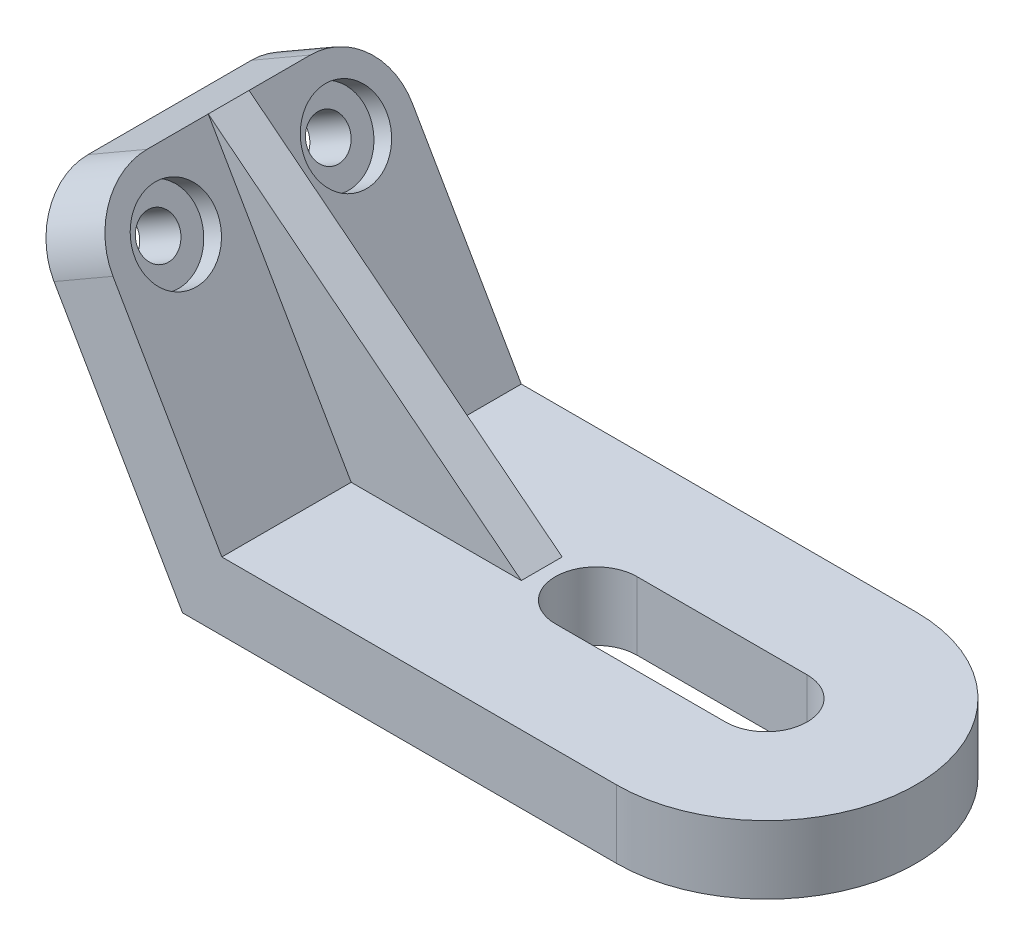
ISO-10303-21;
HEADER;
FILE_DESCRIPTION(('STEP AP214'),'2;1');
FILE_NAME('part.step','',(''),(''),'','','');
FILE_SCHEMA(('AUTOMOTIVE_DESIGN { 1 0 10303 214 1 1 1 1 }'));
ENDSEC;
DATA;
#1=APPLICATION_CONTEXT('core data for automotive mechanical design processes');
#2=APPLICATION_PROTOCOL_DEFINITION('international standard','automotive_design',2000,#1);
#3=PRODUCT_CONTEXT('',#1,'mechanical');
#4=PRODUCT('Part','Part','',(#3));
#5=PRODUCT_RELATED_PRODUCT_CATEGORY('part','',(#4));
#6=PRODUCT_DEFINITION_FORMATION('','',#4);
#7=PRODUCT_DEFINITION_CONTEXT('part definition',#1,'design');
#8=PRODUCT_DEFINITION('design','',#6,#7);
#9=PRODUCT_DEFINITION_SHAPE('','',#8);
#10=(LENGTH_UNIT() NAMED_UNIT(*) SI_UNIT(.MILLI.,.METRE.));
#11=(NAMED_UNIT(*) PLANE_ANGLE_UNIT() SI_UNIT($,.RADIAN.));
#12=(NAMED_UNIT(*) SI_UNIT($,.STERADIAN.) SOLID_ANGLE_UNIT());
#13=UNCERTAINTY_MEASURE_WITH_UNIT(LENGTH_MEASURE(1.E-05),#10,'distance_accuracy_value','');
#14=(GEOMETRIC_REPRESENTATION_CONTEXT(3) GLOBAL_UNCERTAINTY_ASSIGNED_CONTEXT((#13)) GLOBAL_UNIT_ASSIGNED_CONTEXT((#10,
#11,#12)) REPRESENTATION_CONTEXT('',''));
#15=CARTESIAN_POINT('',(0.,0.,0.));
#16=DIRECTION('',(0.,0.,1.));
#17=DIRECTION('',(1.,0.,0.));
#18=AXIS2_PLACEMENT_3D('',#15,#16,#17);
#19=CARTESIAN_POINT('',(-58.,9.99999999999999,-22.));
#20=DIRECTION('',(0.86602540378444,0.499999999999999,0.));
#21=DIRECTION('',(-0.499999999999999,0.86602540378444,0.));
#22=AXIS2_PLACEMENT_3D('',#19,#20,#21);
#23=PLANE('',#22);
#24=CARTESIAN_POINT('',(-74.2633297940228,38.1689135034962,-12.5));
#25=DIRECTION('',(0.866025403784439,0.499999999999999,0.));
#26=DIRECTION('',(-0.499999999999999,0.866025403784439,0.));
#27=AXIS2_PLACEMENT_3D('',#24,#25,#26);
#28=CIRCLE('',#27,6.);
#29=CARTESIAN_POINT('',(-77.2633297940228,43.3650659262029,-12.5));
#30=VERTEX_POINT('',#29);
#31=EDGE_CURVE('E395',#30,#30,#28,.T.);
#32=ORIENTED_EDGE('',*,*,#31,.F.);
#33=EDGE_LOOP('',(#32));
#34=FACE_BOUND('',#33,.T.);
#35=DIRECTION('',(-0.499999999999999,0.866025403784439,0.));
#36=VECTOR('',#35,1.);
#37=CARTESIAN_POINT('',(-58.,9.99999999999999,-22.));
#38=LINE('',#37,#36);
#39=CARTESIAN_POINT('',(-58.,9.99999999999999,-22.));
#40=VERTEX_POINT('',#39);
#41=CARTESIAN_POINT('',(-74.,37.7128129211021,-22.));
#42=VERTEX_POINT('',#41);
#43=EDGE_CURVE('E279',#40,#42,#38,.T.);
#44=ORIENTED_EDGE('',*,*,#43,.T.);
#45=CARTESIAN_POINT('',(-74.,37.7128129211021,-12.));
#46=DIRECTION('',(0.86602540378444,0.499999999999999,0.));
#47=DIRECTION('',(-0.499999999999999,0.86602540378444,0.));
#48=AXIS2_PLACEMENT_3D('',#45,#46,#47);
#49=CIRCLE('',#48,10.);
#50=CARTESIAN_POINT('',(-78.9999999999999,46.3730669589465,-12.));
#51=VERTEX_POINT('',#50);
#52=EDGE_CURVE('E162',#42,#51,#49,.T.);
#53=ORIENTED_EDGE('',*,*,#52,.T.);
#54=DIRECTION('',(0.,0.,1.));
#55=VECTOR('',#54,1.);
#56=CARTESIAN_POINT('',(-78.9999999999999,46.3730669589465,-22.));
#57=LINE('',#56,#55);
#58=CARTESIAN_POINT('',(-78.9999999999999,46.3730669589465,-3.));
#59=VERTEX_POINT('',#58);
#60=EDGE_CURVE('E157',#51,#59,#57,.T.);
#61=ORIENTED_EDGE('',*,*,#60,.T.);
#62=DIRECTION('',(0.499999999999999,-0.86602540378444,0.));
#63=VECTOR('',#62,1.);
#64=CARTESIAN_POINT('',(-58.,9.99999999999999,-3.));
#65=LINE('',#64,#63);
#66=CARTESIAN_POINT('',(-58.,9.99999999999999,-3.));
#67=VERTEX_POINT('',#66);
#68=EDGE_CURVE('E159',#59,#67,#65,.T.);
#69=ORIENTED_EDGE('',*,*,#68,.T.);
#70=DIRECTION('',(0.,0.,1.));
#71=VECTOR('',#70,1.);
#72=CARTESIAN_POINT('',(-58.,9.99999999999999,-22.));
#73=LINE('',#72,#71);
#74=EDGE_CURVE('E298',#40,#67,#73,.T.);
#75=ORIENTED_EDGE('',*,*,#74,.F.);
#76=EDGE_LOOP('',(#44,#53,#61,#69,#75));
#77=FACE_BOUND('',#76,.T.);
#78=ADVANCED_FACE('F47',(#34,#77),#23,.T.);
#79=CARTESIAN_POINT('',(0.,0.,-22.));
#80=DIRECTION('',(0.,-1.,0.));
#81=DIRECTION('',(1.,0.,0.));
#82=AXIS2_PLACEMENT_3D('',#79,#80,#81);
#83=PLANE('',#82);
#84=DIRECTION('',(1.,0.,0.));
#85=VECTOR('',#84,1.);
#86=CARTESIAN_POINT('',(0.,0.,22.));
#87=LINE('',#86,#85);
#88=CARTESIAN_POINT('',(-63.7735026918963,0.,22.));
#89=VERTEX_POINT('',#88);
#90=CARTESIAN_POINT('',(0.,0.,22.));
#91=VERTEX_POINT('',#90);
#92=EDGE_CURVE('E267',#89,#91,#87,.T.);
#93=ORIENTED_EDGE('',*,*,#92,.F.);
#94=DIRECTION('',(0.,0.,1.));
#95=VECTOR('',#94,1.);
#96=CARTESIAN_POINT('',(-63.7735026918963,0.,-22.));
#97=LINE('',#96,#95);
#98=CARTESIAN_POINT('',(-63.7735026918963,0.,-22.));
#99=VERTEX_POINT('',#98);
#100=EDGE_CURVE('E290',#99,#89,#97,.T.);
#101=ORIENTED_EDGE('',*,*,#100,.F.);
#102=DIRECTION('',(1.,0.,0.));
#103=VECTOR('',#102,1.);
#104=CARTESIAN_POINT('',(0.,0.,-22.));
#105=LINE('',#104,#103);
#106=CARTESIAN_POINT('',(0.,0.,-22.));
#107=VERTEX_POINT('',#106);
#108=EDGE_CURVE('E285',#99,#107,#105,.T.);
#109=ORIENTED_EDGE('',*,*,#108,.T.);
#110=CARTESIAN_POINT('',(0.,0.,0.));
#111=DIRECTION('',(0.,1.,0.));
#112=DIRECTION('',(-1.,0.,0.));
#113=AXIS2_PLACEMENT_3D('',#110,#111,#112);
#114=CIRCLE('',#113,22.);
#115=EDGE_CURVE('E235',#91,#107,#114,.T.);
#116=ORIENTED_EDGE('',*,*,#115,.F.);
#117=EDGE_LOOP('',(#93,#101,#109,#116));
#118=FACE_BOUND('',#117,.T.);
#119=CARTESIAN_POINT('',(-25.,0.,0.));
#120=DIRECTION('',(0.,1.,0.));
#121=DIRECTION('',(-1.,0.,0.));
#122=AXIS2_PLACEMENT_3D('',#119,#120,#121);
#123=CIRCLE('',#122,6.);
#124=CARTESIAN_POINT('',(-25.,0.,-6.));
#125=VERTEX_POINT('',#124);
#126=CARTESIAN_POINT('',(-25.,0.,6.));
#127=VERTEX_POINT('',#126);
#128=EDGE_CURVE('E207',#125,#127,#123,.T.);
#129=ORIENTED_EDGE('',*,*,#128,.T.);
#130=DIRECTION('',(1.,0.,0.));
#131=VECTOR('',#130,1.);
#132=CARTESIAN_POINT('',(0.,0.,6.));
#133=LINE('',#132,#131);
#134=CARTESIAN_POINT('',(0.,0.,6.));
#135=VERTEX_POINT('',#134);
#136=EDGE_CURVE('E211',#127,#135,#133,.T.);
#137=ORIENTED_EDGE('',*,*,#136,.T.);
#138=CARTESIAN_POINT('',(0.,0.,0.));
#139=DIRECTION('',(0.,1.,0.));
#140=DIRECTION('',(-1.,0.,0.));
#141=AXIS2_PLACEMENT_3D('',#138,#139,#140);
#142=CIRCLE('',#141,6.);
#143=CARTESIAN_POINT('',(0.,0.,-6.));
#144=VERTEX_POINT('',#143);
#145=EDGE_CURVE('E231',#135,#144,#142,.T.);
#146=ORIENTED_EDGE('',*,*,#145,.T.);
#147=DIRECTION('',(1.,0.,0.));
#148=VECTOR('',#147,1.);
#149=CARTESIAN_POINT('',(0.,0.,-6.));
#150=LINE('',#149,#148);
#151=EDGE_CURVE('E204',#125,#144,#150,.T.);
#152=ORIENTED_EDGE('',*,*,#151,.F.);
#153=EDGE_LOOP('',(#129,#137,#146,#152));
#154=FACE_BOUND('',#153,.T.);
#155=ADVANCED_FACE('F330',(#118,#154),#83,.T.);
#156=CARTESIAN_POINT('',(0.,10.,-22.));
#157=DIRECTION('',(0.,1.,0.));
#158=DIRECTION('',(-1.,0.,0.));
#159=AXIS2_PLACEMENT_3D('',#156,#157,#158);
#160=PLANE('',#159);
#161=DIRECTION('',(1.,0.,0.));
#162=VECTOR('',#161,1.);
#163=CARTESIAN_POINT('',(0.,10.,3.));
#164=LINE('',#163,#162);
#165=CARTESIAN_POINT('',(-58.,9.99999999999999,3.));
#166=VERTEX_POINT('',#165);
#167=CARTESIAN_POINT('',(-33.,10.,3.));
#168=VERTEX_POINT('',#167);
#169=EDGE_CURVE('E194',#166,#168,#164,.T.);
#170=ORIENTED_EDGE('',*,*,#169,.F.);
#171=CARTESIAN_POINT('',(-58.,9.99999999999999,22.));
#172=VERTEX_POINT('',#171);
#173=EDGE_CURVE('E289',#166,#172,#73,.T.);
#174=ORIENTED_EDGE('',*,*,#173,.T.);
#175=DIRECTION('',(-1.,0.,0.));
#176=VECTOR('',#175,1.);
#177=CARTESIAN_POINT('',(0.,10.,22.));
#178=LINE('',#177,#176);
#179=CARTESIAN_POINT('',(0.,10.,22.));
#180=VERTEX_POINT('',#179);
#181=EDGE_CURVE('E257',#180,#172,#178,.T.);
#182=ORIENTED_EDGE('',*,*,#181,.F.);
#183=CARTESIAN_POINT('',(0.,10.,0.));
#184=DIRECTION('',(0.,1.,0.));
#185=DIRECTION('',(-1.,0.,0.));
#186=AXIS2_PLACEMENT_3D('',#183,#184,#185);
#187=CIRCLE('',#186,22.);
#188=CARTESIAN_POINT('',(0.,10.,-22.));
#189=VERTEX_POINT('',#188);
#190=EDGE_CURVE('E236',#180,#189,#187,.T.);
#191=ORIENTED_EDGE('',*,*,#190,.T.);
#192=DIRECTION('',(-1.,0.,0.));
#193=VECTOR('',#192,1.);
#194=CARTESIAN_POINT('',(0.,10.,-22.));
#195=LINE('',#194,#193);
#196=EDGE_CURVE('E275',#189,#40,#195,.T.);
#197=ORIENTED_EDGE('',*,*,#196,.T.);
#198=ORIENTED_EDGE('',*,*,#74,.T.);
#199=DIRECTION('',(1.,0.,0.));
#200=VECTOR('',#199,1.);
#201=CARTESIAN_POINT('',(0.,10.,-3.));
#202=LINE('',#201,#200);
#203=CARTESIAN_POINT('',(-33.,10.,-3.));
#204=VERTEX_POINT('',#203);
#205=EDGE_CURVE('E177',#67,#204,#202,.T.);
#206=ORIENTED_EDGE('',*,*,#205,.T.);
#207=DIRECTION('',(0.,0.,1.));
#208=VECTOR('',#207,1.);
#209=CARTESIAN_POINT('',(-33.,10.,-22.));
#210=LINE('',#209,#208);
#211=EDGE_CURVE('E187',#168,#204,#210,.F.);
#212=ORIENTED_EDGE('',*,*,#211,.F.);
#213=EDGE_LOOP('',(#170,#174,#182,#191,#197,#198,#206,#212));
#214=FACE_BOUND('',#213,.T.);
#215=CARTESIAN_POINT('',(-25.,10.,0.));
#216=DIRECTION('',(0.,1.,0.));
#217=DIRECTION('',(-1.,0.,0.));
#218=AXIS2_PLACEMENT_3D('',#215,#216,#217);
#219=CIRCLE('',#218,6.);
#220=CARTESIAN_POINT('',(-25.,10.,-6.));
#221=VERTEX_POINT('',#220);
#222=CARTESIAN_POINT('',(-25.,10.,6.));
#223=VERTEX_POINT('',#222);
#224=EDGE_CURVE('E219',#221,#223,#219,.T.);
#225=ORIENTED_EDGE('',*,*,#224,.F.);
#226=DIRECTION('',(1.,0.,0.));
#227=VECTOR('',#226,1.);
#228=CARTESIAN_POINT('',(0.,10.,-6.));
#229=LINE('',#228,#227);
#230=CARTESIAN_POINT('',(0.,10.,-6.));
#231=VERTEX_POINT('',#230);
#232=EDGE_CURVE('E198',#221,#231,#229,.T.);
#233=ORIENTED_EDGE('',*,*,#232,.T.);
#234=CARTESIAN_POINT('',(0.,10.,0.));
#235=DIRECTION('',(0.,1.,0.));
#236=DIRECTION('',(-1.,0.,0.));
#237=AXIS2_PLACEMENT_3D('',#234,#235,#236);
#238=CIRCLE('',#237,6.);
#239=CARTESIAN_POINT('',(0.,10.,6.));
#240=VERTEX_POINT('',#239);
#241=EDGE_CURVE('E228',#240,#231,#238,.T.);
#242=ORIENTED_EDGE('',*,*,#241,.F.);
#243=DIRECTION('',(1.,0.,0.));
#244=VECTOR('',#243,1.);
#245=CARTESIAN_POINT('',(0.,10.,6.));
#246=LINE('',#245,#244);
#247=EDGE_CURVE('E208',#223,#240,#246,.T.);
#248=ORIENTED_EDGE('',*,*,#247,.F.);
#249=EDGE_LOOP('',(#225,#233,#242,#248));
#250=FACE_BOUND('',#249,.T.);
#251=ADVANCED_FACE('F337',(#214,#250),#160,.T.);
#252=CARTESIAN_POINT('',(-63.7735026918963,0.,-22.));
#253=DIRECTION('',(-0.86602540378444,-0.499999999999998,0.));
#254=DIRECTION('',(0.499999999999998,-0.86602540378444,0.));
#255=AXIS2_PLACEMENT_3D('',#252,#253,#254);
#256=PLANE('',#255);
#257=CARTESIAN_POINT('',(-82.9235838318672,33.1689135034962,12.5));
#258=DIRECTION('',(0.866025403784439,0.499999999999999,0.));
#259=DIRECTION('',(-0.499999999999999,0.866025403784439,0.));
#260=AXIS2_PLACEMENT_3D('',#257,#258,#259);
#261=CIRCLE('',#260,3.);
#262=CARTESIAN_POINT('',(-84.4235838318672,35.7669897148496,12.5));
#263=VERTEX_POINT('',#262);
#264=EDGE_CURVE('E391',#263,#263,#261,.T.);
#265=ORIENTED_EDGE('',*,*,#264,.T.);
#266=EDGE_LOOP('',(#265));
#267=FACE_BOUND('',#266,.T.);
#268=CARTESIAN_POINT('',(-82.9235838318672,33.1689135034962,-12.5));
#269=DIRECTION('',(0.866025403784439,0.499999999999999,0.));
#270=DIRECTION('',(-0.499999999999999,0.866025403784439,0.));
#271=AXIS2_PLACEMENT_3D('',#268,#269,#270);
#272=CIRCLE('',#271,3.);
#273=CARTESIAN_POINT('',(-84.4235838318672,35.7669897148496,-12.5));
#274=VERTEX_POINT('',#273);
#275=EDGE_CURVE('E189',#274,#274,#272,.T.);
#276=ORIENTED_EDGE('',*,*,#275,.T.);
#277=EDGE_LOOP('',(#276));
#278=FACE_BOUND('',#277,.T.);
#279=DIRECTION('',(0.,0.,1.));
#280=VECTOR('',#279,1.);
#281=CARTESIAN_POINT('',(-87.6602540378443,41.3730669589465,-22.));
#282=LINE('',#281,#280);
#283=CARTESIAN_POINT('',(-87.6602540378443,41.3730669589465,-12.));
#284=VERTEX_POINT('',#283);
#285=CARTESIAN_POINT('',(-87.6602540378443,41.3730669589465,12.));
#286=VERTEX_POINT('',#285);
#287=EDGE_CURVE('E168',#284,#286,#282,.T.);
#288=ORIENTED_EDGE('',*,*,#287,.F.);
#289=CARTESIAN_POINT('',(-82.6602540378443,32.7128129211021,-12.));
#290=DIRECTION('',(-0.86602540378444,-0.499999999999998,0.));
#291=DIRECTION('',(0.499999999999998,-0.86602540378444,0.));
#292=AXIS2_PLACEMENT_3D('',#289,#290,#291);
#293=CIRCLE('',#292,10.);
#294=CARTESIAN_POINT('',(-82.6602540378443,32.7128129211021,-22.));
#295=VERTEX_POINT('',#294);
#296=EDGE_CURVE('E309',#284,#295,#293,.T.);
#297=ORIENTED_EDGE('',*,*,#296,.T.);
#298=DIRECTION('',(0.499999999999998,-0.86602540378444,0.));
#299=VECTOR('',#298,1.);
#300=CARTESIAN_POINT('',(-63.7735026918963,0.,-22.));
#301=LINE('',#300,#299);
#302=EDGE_CURVE('E282',#295,#99,#301,.T.);
#303=ORIENTED_EDGE('',*,*,#302,.T.);
#304=ORIENTED_EDGE('',*,*,#100,.T.);
#305=DIRECTION('',(0.499999999999998,-0.86602540378444,0.));
#306=VECTOR('',#305,1.);
#307=CARTESIAN_POINT('',(-63.7735026918963,0.,22.));
#308=LINE('',#307,#306);
#309=CARTESIAN_POINT('',(-82.6602540378443,32.7128129211021,22.));
#310=VERTEX_POINT('',#309);
#311=EDGE_CURVE('E264',#310,#89,#308,.T.);
#312=ORIENTED_EDGE('',*,*,#311,.F.);
#313=CARTESIAN_POINT('',(-82.6602540378444,32.7128129211021,12.));
#314=DIRECTION('',(-0.86602540378444,-0.499999999999998,0.));
#315=DIRECTION('',(0.499999999999998,-0.86602540378444,0.));
#316=AXIS2_PLACEMENT_3D('',#313,#314,#315);
#317=CIRCLE('',#316,10.);
#318=EDGE_CURVE('E306',#310,#286,#317,.T.);
#319=ORIENTED_EDGE('',*,*,#318,.T.);
#320=EDGE_LOOP('',(#288,#297,#303,#304,#312,#319));
#321=FACE_BOUND('',#320,.T.);
#322=ADVANCED_FACE('F324',(#267,#278,#321),#256,.T.);
#323=CARTESIAN_POINT('',(-87.6602540378443,41.3730669589465,-22.));
#324=DIRECTION('',(-0.499999999999998,0.86602540378444,0.));
#325=DIRECTION('',(-0.86602540378444,-0.499999999999998,0.));
#326=AXIS2_PLACEMENT_3D('',#323,#324,#325);
#327=PLANE('',#326);
#328=ORIENTED_EDGE('',*,*,#60,.F.);
#329=DIRECTION('',(-0.86602540378444,-0.499999999999998,0.));
#330=VECTOR('',#329,1.);
#331=CARTESIAN_POINT('',(-87.6602540378443,41.3730669589465,-12.));
#332=LINE('',#331,#330);
#333=EDGE_CURVE('E303',#51,#284,#332,.T.);
#334=ORIENTED_EDGE('',*,*,#333,.T.);
#335=ORIENTED_EDGE('',*,*,#287,.T.);
#336=DIRECTION('',(-0.86602540378444,-0.499999999999998,0.));
#337=VECTOR('',#336,1.);
#338=CARTESIAN_POINT('',(-87.6602540378443,41.3730669589465,12.));
#339=LINE('',#338,#337);
#340=CARTESIAN_POINT('',(-78.9999999999999,46.3730669589465,12.));
#341=VERTEX_POINT('',#340);
#342=EDGE_CURVE('E294',#286,#341,#339,.F.);
#343=ORIENTED_EDGE('',*,*,#342,.T.);
#344=CARTESIAN_POINT('',(-78.9999999999999,46.3730669589465,3.));
#345=VERTEX_POINT('',#344);
#346=EDGE_CURVE('E169',#345,#341,#57,.T.);
#347=ORIENTED_EDGE('',*,*,#346,.F.);
#348=DIRECTION('',(0.,0.,-1.));
#349=VECTOR('',#348,1.);
#350=CARTESIAN_POINT('',(-78.9999999999999,46.3730669589465,-22.));
#351=LINE('',#350,#349);
#352=EDGE_CURVE('E184',#59,#345,#351,.F.);
#353=ORIENTED_EDGE('',*,*,#352,.F.);
#354=EDGE_LOOP('',(#328,#334,#335,#343,#347,#353));
#355=FACE_BOUND('',#354,.T.);
#356=ADVANCED_FACE('F192',(#355),#327,.T.);
#357=CARTESIAN_POINT('',(-74.2633297940228,38.1689135034962,12.5));
#358=DIRECTION('',(0.866025403784439,0.499999999999999,0.));
#359=DIRECTION('',(-0.499999999999999,0.866025403784439,0.));
#360=AXIS2_PLACEMENT_3D('',#357,#358,#359);
#361=CIRCLE('',#360,6.);
#362=CARTESIAN_POINT('',(-77.2633297940228,43.3650659262029,12.5));
#363=VERTEX_POINT('',#362);
#364=EDGE_CURVE('E378',#363,#363,#361,.T.);
#365=ORIENTED_EDGE('',*,*,#364,.F.);
#366=EDGE_LOOP('',(#365));
#367=FACE_BOUND('',#366,.T.);
#368=ORIENTED_EDGE('',*,*,#346,.T.);
#369=CARTESIAN_POINT('',(-74.,37.7128129211021,12.));
#370=DIRECTION('',(0.86602540378444,0.499999999999999,0.));
#371=DIRECTION('',(-0.499999999999999,0.86602540378444,0.));
#372=AXIS2_PLACEMENT_3D('',#369,#370,#371);
#373=CIRCLE('',#372,10.);
#374=CARTESIAN_POINT('',(-73.9999999999999,37.7128129211021,22.));
#375=VERTEX_POINT('',#374);
#376=EDGE_CURVE('E11',#341,#375,#373,.T.);
#377=ORIENTED_EDGE('',*,*,#376,.T.);
#378=DIRECTION('',(-0.499999999999999,0.866025403784439,0.));
#379=VECTOR('',#378,1.);
#380=CARTESIAN_POINT('',(-58.,9.99999999999999,22.));
#381=LINE('',#380,#379);
#382=EDGE_CURVE('E261',#172,#375,#381,.T.);
#383=ORIENTED_EDGE('',*,*,#382,.F.);
#384=ORIENTED_EDGE('',*,*,#173,.F.);
#385=DIRECTION('',(0.499999999999999,-0.86602540378444,0.));
#386=VECTOR('',#385,1.);
#387=CARTESIAN_POINT('',(-58.,9.99999999999999,3.));
#388=LINE('',#387,#386);
#389=EDGE_CURVE('E200',#345,#166,#388,.T.);
#390=ORIENTED_EDGE('',*,*,#389,.F.);
#391=EDGE_LOOP('',(#368,#377,#383,#384,#390));
#392=FACE_BOUND('',#391,.T.);
#393=ADVANCED_FACE('F343',(#367,#392),#23,.T.);
#394=CARTESIAN_POINT('',(0.,0.,-22.));
#395=DIRECTION('',(0.,0.,1.));
#396=DIRECTION('',(1.,0.,0.));
#397=AXIS2_PLACEMENT_3D('',#394,#395,#396);
#398=PLANE('',#397);
#399=ORIENTED_EDGE('',*,*,#302,.F.);
#400=DIRECTION('',(-0.86602540378444,-0.499999999999998,0.));
#401=VECTOR('',#400,1.);
#402=CARTESIAN_POINT('',(-74.,37.7128129211021,-22.));
#403=LINE('',#402,#401);
#404=EDGE_CURVE('E69',#295,#42,#403,.F.);
#405=ORIENTED_EDGE('',*,*,#404,.T.);
#406=ORIENTED_EDGE('',*,*,#43,.F.);
#407=ORIENTED_EDGE('',*,*,#196,.F.);
#408=DIRECTION('',(0.,1.,0.));
#409=VECTOR('',#408,1.);
#410=CARTESIAN_POINT('',(0.,0.,-22.));
#411=LINE('',#410,#409);
#412=EDGE_CURVE('E271',#107,#189,#411,.T.);
#413=ORIENTED_EDGE('',*,*,#412,.F.);
#414=ORIENTED_EDGE('',*,*,#108,.F.);
#415=EDGE_LOOP('',(#399,#405,#406,#407,#413,#414));
#416=FACE_BOUND('',#415,.T.);
#417=ADVANCED_FACE('F346',(#416),#398,.F.);
#418=CARTESIAN_POINT('',(0.,0.,22.));
#419=DIRECTION('',(0.,0.,1.));
#420=DIRECTION('',(1.,0.,0.));
#421=AXIS2_PLACEMENT_3D('',#418,#419,#420);
#422=PLANE('',#421);
#423=ORIENTED_EDGE('',*,*,#382,.T.);
#424=DIRECTION('',(-0.86602540378444,-0.499999999999998,0.));
#425=VECTOR('',#424,1.);
#426=CARTESIAN_POINT('',(-34.830127018922,60.3275496308507,22.));
#427=LINE('',#426,#425);
#428=EDGE_CURVE('E56',#375,#310,#427,.T.);
#429=ORIENTED_EDGE('',*,*,#428,.T.);
#430=ORIENTED_EDGE('',*,*,#311,.T.);
#431=ORIENTED_EDGE('',*,*,#92,.T.);
#432=DIRECTION('',(0.,1.,0.));
#433=VECTOR('',#432,1.);
#434=CARTESIAN_POINT('',(0.,0.,22.));
#435=LINE('',#434,#433);
#436=EDGE_CURVE('E250',#91,#180,#435,.T.);
#437=ORIENTED_EDGE('',*,*,#436,.T.);
#438=ORIENTED_EDGE('',*,*,#181,.T.);
#439=EDGE_LOOP('',(#423,#429,#430,#431,#437,#438));
#440=FACE_BOUND('',#439,.T.);
#441=ADVANCED_FACE('F320',(#440),#422,.T.);
#442=CARTESIAN_POINT('',(0.,0.,0.));
#443=DIRECTION('',(0.,1.,0.));
#444=DIRECTION('',(-1.,0.,0.));
#445=AXIS2_PLACEMENT_3D('',#442,#443,#444);
#446=CYLINDRICAL_SURFACE('',#445,6.);
#447=ORIENTED_EDGE('',*,*,#241,.T.);
#448=DIRECTION('',(0.,1.,0.));
#449=VECTOR('',#448,1.);
#450=CARTESIAN_POINT('',(0.,0.,-6.));
#451=LINE('',#450,#449);
#452=EDGE_CURVE('E247',#144,#231,#451,.T.);
#453=ORIENTED_EDGE('',*,*,#452,.F.);
#454=ORIENTED_EDGE('',*,*,#145,.F.);
#455=DIRECTION('',(0.,1.,0.));
#456=VECTOR('',#455,1.);
#457=CARTESIAN_POINT('',(0.,0.,6.));
#458=LINE('',#457,#456);
#459=EDGE_CURVE('E240',#135,#240,#458,.T.);
#460=ORIENTED_EDGE('',*,*,#459,.T.);
#461=EDGE_LOOP('',(#447,#453,#454,#460));
#462=FACE_BOUND('',#461,.T.);
#463=ADVANCED_FACE('F442',(#462),#446,.F.);
#464=CARTESIAN_POINT('',(0.,0.,0.));
#465=DIRECTION('',(0.,1.,0.));
#466=DIRECTION('',(-1.,0.,0.));
#467=AXIS2_PLACEMENT_3D('',#464,#465,#466);
#468=CYLINDRICAL_SURFACE('',#467,22.);
#469=ORIENTED_EDGE('',*,*,#190,.F.);
#470=ORIENTED_EDGE('',*,*,#436,.F.);
#471=ORIENTED_EDGE('',*,*,#115,.T.);
#472=ORIENTED_EDGE('',*,*,#412,.T.);
#473=EDGE_LOOP('',(#469,#470,#471,#472));
#474=FACE_BOUND('',#473,.T.);
#475=ADVANCED_FACE('F334',(#474),#468,.T.);
#476=CARTESIAN_POINT('',(0.,0.,-6.));
#477=DIRECTION('',(0.,0.,1.));
#478=DIRECTION('',(1.,0.,0.));
#479=AXIS2_PLACEMENT_3D('',#476,#477,#478);
#480=PLANE('',#479);
#481=ORIENTED_EDGE('',*,*,#232,.F.);
#482=DIRECTION('',(0.,1.,0.));
#483=VECTOR('',#482,1.);
#484=CARTESIAN_POINT('',(-25.,0.,-6.));
#485=LINE('',#484,#483);
#486=EDGE_CURVE('E215',#125,#221,#485,.T.);
#487=ORIENTED_EDGE('',*,*,#486,.F.);
#488=ORIENTED_EDGE('',*,*,#151,.T.);
#489=ORIENTED_EDGE('',*,*,#452,.T.);
#490=EDGE_LOOP('',(#481,#487,#488,#489));
#491=FACE_BOUND('',#490,.T.);
#492=ADVANCED_FACE('F434',(#491),#480,.T.);
#493=CARTESIAN_POINT('',(0.,0.,6.));
#494=DIRECTION('',(0.,0.,1.));
#495=DIRECTION('',(1.,0.,0.));
#496=AXIS2_PLACEMENT_3D('',#493,#494,#495);
#497=PLANE('',#496);
#498=ORIENTED_EDGE('',*,*,#247,.T.);
#499=ORIENTED_EDGE('',*,*,#459,.F.);
#500=ORIENTED_EDGE('',*,*,#136,.F.);
#501=DIRECTION('',(0.,1.,0.));
#502=VECTOR('',#501,1.);
#503=CARTESIAN_POINT('',(-25.,0.,6.));
#504=LINE('',#503,#502);
#505=EDGE_CURVE('E225',#127,#223,#504,.T.);
#506=ORIENTED_EDGE('',*,*,#505,.T.);
#507=EDGE_LOOP('',(#498,#499,#500,#506));
#508=FACE_BOUND('',#507,.T.);
#509=ADVANCED_FACE('F424',(#508),#497,.F.);
#510=CARTESIAN_POINT('',(-25.,0.,0.));
#511=DIRECTION('',(0.,1.,0.));
#512=DIRECTION('',(-1.,0.,0.));
#513=AXIS2_PLACEMENT_3D('',#510,#511,#512);
#514=CYLINDRICAL_SURFACE('',#513,6.);
#515=ORIENTED_EDGE('',*,*,#505,.F.);
#516=ORIENTED_EDGE('',*,*,#128,.F.);
#517=ORIENTED_EDGE('',*,*,#486,.T.);
#518=ORIENTED_EDGE('',*,*,#224,.T.);
#519=EDGE_LOOP('',(#515,#516,#517,#518));
#520=FACE_BOUND('',#519,.T.);
#521=ADVANCED_FACE('F417',(#520),#514,.F.);
#522=CARTESIAN_POINT('',(-32.8301270189222,23.1865334794732,3.));
#523=DIRECTION('',(0.,0.,1.));
#524=DIRECTION('',(1.,0.,0.));
#525=AXIS2_PLACEMENT_3D('',#522,#523,#524);
#526=PLANE('',#525);
#527=ORIENTED_EDGE('',*,*,#389,.T.);
#528=ORIENTED_EDGE('',*,*,#169,.T.);
#529=DIRECTION('',(0.784407511397737,-0.620245802938488,0.));
#530=VECTOR('',#529,1.);
#531=CARTESIAN_POINT('',(-78.9999999999999,46.3730669589465,3.));
#532=LINE('',#531,#530);
#533=EDGE_CURVE('E179',#345,#168,#532,.T.);
#534=ORIENTED_EDGE('',*,*,#533,.F.);
#535=EDGE_LOOP('',(#527,#528,#534));
#536=FACE_BOUND('',#535,.T.);
#537=ADVANCED_FACE('F415',(#536),#526,.T.);
#538=CARTESIAN_POINT('',(-32.8301270189222,23.1865334794732,-3.));
#539=DIRECTION('',(0.,0.,1.));
#540=DIRECTION('',(1.,0.,0.));
#541=AXIS2_PLACEMENT_3D('',#538,#539,#540);
#542=PLANE('',#541);
#543=ORIENTED_EDGE('',*,*,#205,.F.);
#544=ORIENTED_EDGE('',*,*,#68,.F.);
#545=DIRECTION('',(0.784407511397737,-0.620245802938488,0.));
#546=VECTOR('',#545,1.);
#547=CARTESIAN_POINT('',(-78.9999999999999,46.3730669589465,-3.));
#548=LINE('',#547,#546);
#549=EDGE_CURVE('E175',#59,#204,#548,.T.);
#550=ORIENTED_EDGE('',*,*,#549,.T.);
#551=EDGE_LOOP('',(#543,#544,#550));
#552=FACE_BOUND('',#551,.T.);
#553=ADVANCED_FACE('F174',(#552),#542,.F.);
#554=CARTESIAN_POINT('',(-78.9999999999999,46.3730669589465,0.));
#555=DIRECTION('',(-0.620245802938488,-0.784407511397736,0.));
#556=DIRECTION('',(0.784407511397737,-0.620245802938488,0.));
#557=AXIS2_PLACEMENT_3D('',#554,#555,#556);
#558=PLANE('',#557);
#559=ORIENTED_EDGE('',*,*,#533,.T.);
#560=ORIENTED_EDGE('',*,*,#211,.T.);
#561=ORIENTED_EDGE('',*,*,#549,.F.);
#562=ORIENTED_EDGE('',*,*,#352,.T.);
#563=EDGE_LOOP('',(#559,#560,#561,#562));
#564=FACE_BOUND('',#563,.T.);
#565=ADVANCED_FACE('F183',(#564),#558,.F.);
#566=CARTESIAN_POINT('',(-74.2633297940228,38.1689135034962,-12.5));
#567=DIRECTION('',(0.866025403784439,0.499999999999999,0.));
#568=DIRECTION('',(-0.499999999999999,0.866025403784439,0.));
#569=AXIS2_PLACEMENT_3D('',#566,#567,#568);
#570=CYLINDRICAL_SURFACE('',#569,3.);
#571=ORIENTED_EDGE('',*,*,#275,.F.);
#572=EDGE_LOOP('',(#571));
#573=FACE_BOUND('',#572,.T.);
#574=CARTESIAN_POINT('',(-76.8614060053761,36.6689135034962,-12.5));
#575=DIRECTION('',(0.866025403784439,0.499999999999999,0.));
#576=DIRECTION('',(-0.499999999999999,0.866025403784439,0.));
#577=AXIS2_PLACEMENT_3D('',#574,#575,#576);
#578=CIRCLE('',#577,3.);
#579=CARTESIAN_POINT('',(-78.3614060053761,39.2669897148496,-12.5));
#580=VERTEX_POINT('',#579);
#581=EDGE_CURVE('E403',#580,#580,#578,.T.);
#582=ORIENTED_EDGE('',*,*,#581,.T.);
#583=EDGE_LOOP('',(#582));
#584=FACE_BOUND('',#583,.T.);
#585=ADVANCED_FACE('F428',(#573,#584),#570,.F.);
#586=CARTESIAN_POINT('',(-76.8614060053761,36.6689135034962,-9.5));
#587=DIRECTION('',(-0.866025403784439,-0.499999999999999,0.));
#588=DIRECTION('',(0.499999999999999,-0.866025403784439,0.));
#589=AXIS2_PLACEMENT_3D('',#586,#587,#588);
#590=PLANE('',#589);
#591=ORIENTED_EDGE('',*,*,#581,.F.);
#592=EDGE_LOOP('',(#591));
#593=FACE_BOUND('',#592,.T.);
#594=CARTESIAN_POINT('',(-76.8614060053761,36.6689135034962,-12.5));
#595=DIRECTION('',(0.866025403784439,0.499999999999999,0.));
#596=DIRECTION('',(-0.499999999999999,0.866025403784439,0.));
#597=AXIS2_PLACEMENT_3D('',#594,#595,#596);
#598=CIRCLE('',#597,6.);
#599=CARTESIAN_POINT('',(-79.8614060053761,41.8650659262029,-12.5));
#600=VERTEX_POINT('',#599);
#601=EDGE_CURVE('E399',#600,#600,#598,.T.);
#602=ORIENTED_EDGE('',*,*,#601,.T.);
#603=EDGE_LOOP('',(#602));
#604=FACE_BOUND('',#603,.T.);
#605=ADVANCED_FACE('F457',(#593,#604),#590,.F.);
#606=CARTESIAN_POINT('',(-74.2633297940228,38.1689135034962,-12.5));
#607=DIRECTION('',(0.866025403784439,0.499999999999999,0.));
#608=DIRECTION('',(-0.499999999999999,0.866025403784439,0.));
#609=AXIS2_PLACEMENT_3D('',#606,#607,#608);
#610=CYLINDRICAL_SURFACE('',#609,6.);
#611=ORIENTED_EDGE('',*,*,#601,.F.);
#612=EDGE_LOOP('',(#611));
#613=FACE_BOUND('',#612,.T.);
#614=ORIENTED_EDGE('',*,*,#31,.T.);
#615=EDGE_LOOP('',(#614));
#616=FACE_BOUND('',#615,.T.);
#617=ADVANCED_FACE('F462',(#613,#616),#610,.F.);
#618=CARTESIAN_POINT('',(-74.2633297940228,38.1689135034962,12.5));
#619=DIRECTION('',(0.866025403784439,0.499999999999999,0.));
#620=DIRECTION('',(-0.499999999999999,0.866025403784439,0.));
#621=AXIS2_PLACEMENT_3D('',#618,#619,#620);
#622=CYLINDRICAL_SURFACE('',#621,3.);
#623=ORIENTED_EDGE('',*,*,#264,.F.);
#624=EDGE_LOOP('',(#623));
#625=FACE_BOUND('',#624,.T.);
#626=CARTESIAN_POINT('',(-76.8614060053761,36.6689135034962,12.5));
#627=DIRECTION('',(0.866025403784439,0.499999999999999,0.));
#628=DIRECTION('',(-0.499999999999999,0.866025403784439,0.));
#629=AXIS2_PLACEMENT_3D('',#626,#627,#628);
#630=CIRCLE('',#629,3.);
#631=CARTESIAN_POINT('',(-78.3614060053761,39.2669897148496,12.5));
#632=VERTEX_POINT('',#631);
#633=EDGE_CURVE('E385',#632,#632,#630,.T.);
#634=ORIENTED_EDGE('',*,*,#633,.T.);
#635=EDGE_LOOP('',(#634));
#636=FACE_BOUND('',#635,.T.);
#637=ADVANCED_FACE('F467',(#625,#636),#622,.F.);
#638=CARTESIAN_POINT('',(-76.8614060053761,36.6689135034962,15.5));
#639=DIRECTION('',(-0.866025403784439,-0.499999999999999,0.));
#640=DIRECTION('',(0.499999999999999,-0.866025403784439,0.));
#641=AXIS2_PLACEMENT_3D('',#638,#639,#640);
#642=PLANE('',#641);
#643=ORIENTED_EDGE('',*,*,#633,.F.);
#644=EDGE_LOOP('',(#643));
#645=FACE_BOUND('',#644,.T.);
#646=CARTESIAN_POINT('',(-76.8614060053761,36.6689135034962,12.5));
#647=DIRECTION('',(0.866025403784439,0.499999999999999,0.));
#648=DIRECTION('',(-0.499999999999999,0.866025403784439,0.));
#649=AXIS2_PLACEMENT_3D('',#646,#647,#648);
#650=CIRCLE('',#649,6.);
#651=CARTESIAN_POINT('',(-79.8614060053761,41.8650659262029,12.5));
#652=VERTEX_POINT('',#651);
#653=EDGE_CURVE('E381',#652,#652,#650,.T.);
#654=ORIENTED_EDGE('',*,*,#653,.T.);
#655=EDGE_LOOP('',(#654));
#656=FACE_BOUND('',#655,.T.);
#657=ADVANCED_FACE('F355',(#645,#656),#642,.F.);
#658=CARTESIAN_POINT('',(-74.2633297940228,38.1689135034962,12.5));
#659=DIRECTION('',(0.866025403784439,0.499999999999999,0.));
#660=DIRECTION('',(-0.499999999999999,0.866025403784439,0.));
#661=AXIS2_PLACEMENT_3D('',#658,#659,#660);
#662=CYLINDRICAL_SURFACE('',#661,6.);
#663=ORIENTED_EDGE('',*,*,#653,.F.);
#664=EDGE_LOOP('',(#663));
#665=FACE_BOUND('',#664,.T.);
#666=ORIENTED_EDGE('',*,*,#364,.T.);
#667=EDGE_LOOP('',(#666));
#668=FACE_BOUND('',#667,.T.);
#669=ADVANCED_FACE('F349',(#665,#668),#662,.F.);
#670=CARTESIAN_POINT('',(-82.6602540378443,32.7128129211021,-12.));
#671=DIRECTION('',(0.86602540378444,0.499999999999998,0.));
#672=DIRECTION('',(-0.499999999999998,0.86602540378444,0.));
#673=AXIS2_PLACEMENT_3D('',#670,#671,#672);
#674=CYLINDRICAL_SURFACE('',#673,10.);
#675=ORIENTED_EDGE('',*,*,#52,.F.);
#676=ORIENTED_EDGE('',*,*,#404,.F.);
#677=ORIENTED_EDGE('',*,*,#296,.F.);
#678=ORIENTED_EDGE('',*,*,#333,.F.);
#679=EDGE_LOOP('',(#675,#676,#677,#678));
#680=FACE_BOUND('',#679,.T.);
#681=ADVANCED_FACE('F347',(#680),#674,.T.);
#682=CARTESIAN_POINT('',(-34.830127018922,60.3275496308507,12.));
#683=DIRECTION('',(-0.86602540378444,-0.499999999999998,0.));
#684=DIRECTION('',(0.499999999999998,-0.86602540378444,0.));
#685=AXIS2_PLACEMENT_3D('',#682,#683,#684);
#686=CYLINDRICAL_SURFACE('',#685,10.);
#687=ORIENTED_EDGE('',*,*,#376,.F.);
#688=ORIENTED_EDGE('',*,*,#342,.F.);
#689=ORIENTED_EDGE('',*,*,#318,.F.);
#690=ORIENTED_EDGE('',*,*,#428,.F.);
#691=EDGE_LOOP('',(#687,#688,#689,#690));
#692=FACE_BOUND('',#691,.T.);
#693=ADVANCED_FACE('F49',(#692),#686,.T.);
#694=CLOSED_SHELL('',(#78,#155,#251,#322,#356,#393,#417,#441,#463,#475,#492,#509,#521,#537,#553,
#565,#585,#605,#617,#637,#657,#669,#681,#693));
#695=MANIFOLD_SOLID_BREP('B2',#694);
#696=ADVANCED_BREP_SHAPE_REPRESENTATION('',(#18,#695),#14);
#697=SHAPE_DEFINITION_REPRESENTATION(#9,#696);
ENDSEC;
END-ISO-10303-21;
